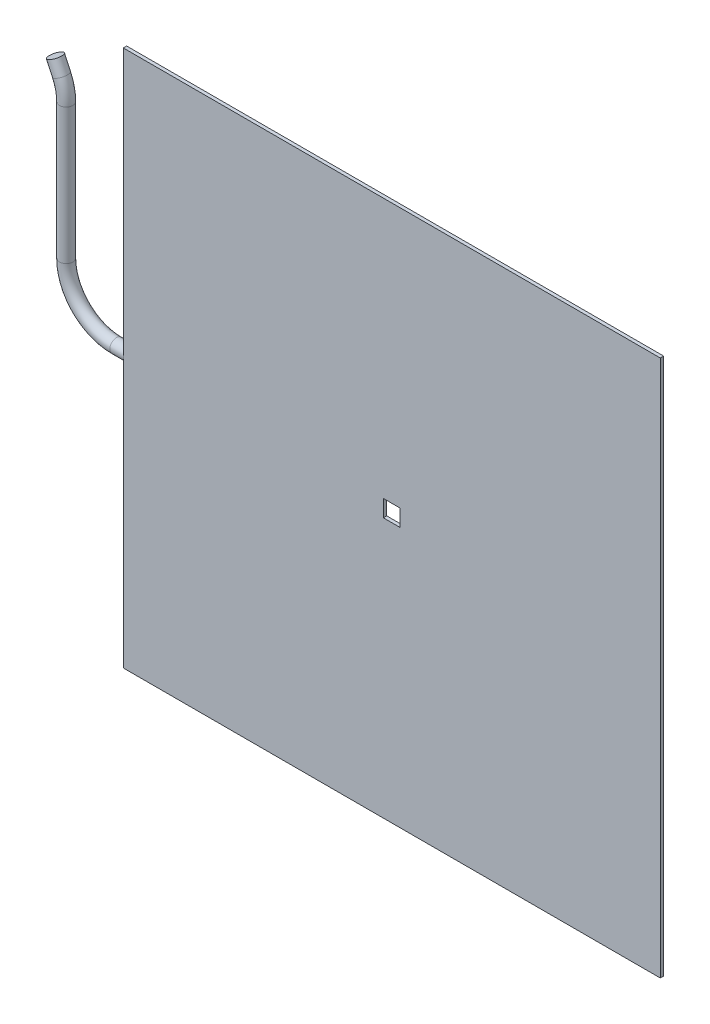
ISO-10303-21;
HEADER;
FILE_DESCRIPTION(('STEP AP214'),'2;1');
FILE_NAME('part.step','',(''),(''),'','','');
FILE_SCHEMA(('AUTOMOTIVE_DESIGN { 1 0 10303 214 1 1 1 1 }'));
ENDSEC;
DATA;
#1=APPLICATION_CONTEXT('core data for automotive mechanical design processes');
#2=APPLICATION_PROTOCOL_DEFINITION('international standard','automotive_design',2000,#1);
#3=PRODUCT_CONTEXT('',#1,'mechanical');
#4=PRODUCT('Part','Part','',(#3));
#5=PRODUCT_RELATED_PRODUCT_CATEGORY('part','',(#4));
#6=PRODUCT_DEFINITION_FORMATION('','',#4);
#7=PRODUCT_DEFINITION_CONTEXT('part definition',#1,'design');
#8=PRODUCT_DEFINITION('design','',#6,#7);
#9=PRODUCT_DEFINITION_SHAPE('','',#8);
#10=(LENGTH_UNIT() NAMED_UNIT(*) SI_UNIT(.MILLI.,.METRE.));
#11=(NAMED_UNIT(*) PLANE_ANGLE_UNIT() SI_UNIT($,.RADIAN.));
#12=(NAMED_UNIT(*) SI_UNIT($,.STERADIAN.) SOLID_ANGLE_UNIT());
#13=UNCERTAINTY_MEASURE_WITH_UNIT(LENGTH_MEASURE(1.E-05),#10,'distance_accuracy_value','');
#14=(GEOMETRIC_REPRESENTATION_CONTEXT(3) GLOBAL_UNCERTAINTY_ASSIGNED_CONTEXT((#13)) GLOBAL_UNIT_ASSIGNED_CONTEXT((#10,
#11,#12)) REPRESENTATION_CONTEXT('',''));
#15=CARTESIAN_POINT('',(0.,0.,0.));
#16=DIRECTION('',(0.,0.,1.));
#17=DIRECTION('',(1.,0.,0.));
#18=AXIS2_PLACEMENT_3D('',#15,#16,#17);
#19=CARTESIAN_POINT('',(-160.,-160.,1.5));
#20=DIRECTION('',(-0.707106781186547,0.,-0.707106781186547));
#21=DIRECTION('',(0.,1.,0.));
#22=AXIS2_PLACEMENT_3D('',#19,#20,#21);
#23=PLANE('',#22);
#24=DIRECTION('',(-0.707106781186548,0.,0.707106781186548));
#25=VECTOR('',#24,1.);
#26=CARTESIAN_POINT('',(-160.,-25.,1.50000000000002));
#27=LINE('',#26,#25);
#28=CARTESIAN_POINT('',(-158.5,-25.,0.));
#29=VERTEX_POINT('',#28);
#30=CARTESIAN_POINT('',(-160.,-25.,1.5));
#31=VERTEX_POINT('',#30);
#32=EDGE_CURVE('E323',#29,#31,#27,.T.);
#33=ORIENTED_EDGE('',*,*,#32,.F.);
#34=DIRECTION('',(0.,1.,0.));
#35=VECTOR('',#34,1.);
#36=CARTESIAN_POINT('',(-158.5,160.,0.));
#37=LINE('',#36,#35);
#38=CARTESIAN_POINT('',(-158.5,-158.5,0.));
#39=VERTEX_POINT('',#38);
#40=EDGE_CURVE('E280',#39,#29,#37,.T.);
#41=ORIENTED_EDGE('',*,*,#40,.F.);
#42=DIRECTION('',(0.577350269189626,0.577350269189626,-0.577350269189626));
#43=VECTOR('',#42,1.);
#44=CARTESIAN_POINT('',(-160.,-160.,1.5));
#45=LINE('',#44,#43);
#46=CARTESIAN_POINT('',(-160.,-160.,1.5));
#47=VERTEX_POINT('',#46);
#48=EDGE_CURVE('E309',#39,#47,#45,.F.);
#49=ORIENTED_EDGE('',*,*,#48,.T.);
#50=DIRECTION('',(0.,-1.,0.));
#51=VECTOR('',#50,1.);
#52=CARTESIAN_POINT('',(-160.,-160.,1.5));
#53=LINE('',#52,#51);
#54=EDGE_CURVE('E286',#31,#47,#53,.T.);
#55=ORIENTED_EDGE('',*,*,#54,.F.);
#56=EDGE_LOOP('',(#33,#41,#49,#55));
#57=FACE_BOUND('',#56,.T.);
#58=ADVANCED_FACE('F38',(#57),#23,.T.);
#59=CARTESIAN_POINT('',(160.,-160.,3.5));
#60=DIRECTION('',(-1.,0.,0.));
#61=DIRECTION('',(0.,0.,1.));
#62=AXIS2_PLACEMENT_3D('',#59,#60,#61);
#63=PLANE('',#62);
#64=DIRECTION('',(0.,0.,-1.));
#65=VECTOR('',#64,1.);
#66=CARTESIAN_POINT('',(160.,-160.,3.5));
#67=LINE('',#66,#65);
#68=CARTESIAN_POINT('',(160.,-160.,3.5));
#69=VERTEX_POINT('',#68);
#70=CARTESIAN_POINT('',(160.,-160.,1.5));
#71=VERTEX_POINT('',#70);
#72=EDGE_CURVE('E251',#69,#71,#67,.T.);
#73=ORIENTED_EDGE('',*,*,#72,.T.);
#74=DIRECTION('',(0.,1.,0.));
#75=VECTOR('',#74,1.);
#76=CARTESIAN_POINT('',(160.,160.,1.5));
#77=LINE('',#76,#75);
#78=CARTESIAN_POINT('',(160.,160.,1.5));
#79=VERTEX_POINT('',#78);
#80=EDGE_CURVE('E292',#71,#79,#77,.T.);
#81=ORIENTED_EDGE('',*,*,#80,.T.);
#82=DIRECTION('',(0.,0.,-1.));
#83=VECTOR('',#82,1.);
#84=CARTESIAN_POINT('',(160.,160.,3.5));
#85=LINE('',#84,#83);
#86=CARTESIAN_POINT('',(160.,160.,3.5));
#87=VERTEX_POINT('',#86);
#88=EDGE_CURVE('E260',#87,#79,#85,.T.);
#89=ORIENTED_EDGE('',*,*,#88,.F.);
#90=DIRECTION('',(0.,1.,0.));
#91=VECTOR('',#90,1.);
#92=CARTESIAN_POINT('',(160.,-160.,3.5));
#93=LINE('',#92,#91);
#94=EDGE_CURVE('E234',#69,#87,#93,.T.);
#95=ORIENTED_EDGE('',*,*,#94,.F.);
#96=EDGE_LOOP('',(#73,#81,#89,#95));
#97=FACE_BOUND('',#96,.T.);
#98=ADVANCED_FACE('F437',(#97),#63,.F.);
#99=CARTESIAN_POINT('',(-160.,160.,3.5));
#100=DIRECTION('',(0.,-1.,0.));
#101=DIRECTION('',(0.,0.,-1.));
#102=AXIS2_PLACEMENT_3D('',#99,#100,#101);
#103=PLANE('',#102);
#104=ORIENTED_EDGE('',*,*,#88,.T.);
#105=DIRECTION('',(-1.,0.,0.));
#106=VECTOR('',#105,1.);
#107=CARTESIAN_POINT('',(-160.,160.,1.5));
#108=LINE('',#107,#106);
#109=CARTESIAN_POINT('',(-160.,160.,1.5));
#110=VERTEX_POINT('',#109);
#111=EDGE_CURVE('E263',#79,#110,#108,.T.);
#112=ORIENTED_EDGE('',*,*,#111,.T.);
#113=DIRECTION('',(0.,0.,-1.));
#114=VECTOR('',#113,1.);
#115=CARTESIAN_POINT('',(-160.,160.,3.5));
#116=LINE('',#115,#114);
#117=CARTESIAN_POINT('',(-160.,160.,3.5));
#118=VERTEX_POINT('',#117);
#119=EDGE_CURVE('E257',#118,#110,#116,.T.);
#120=ORIENTED_EDGE('',*,*,#119,.F.);
#121=DIRECTION('',(-1.,0.,0.));
#122=VECTOR('',#121,1.);
#123=CARTESIAN_POINT('',(-160.,160.,3.5));
#124=LINE('',#123,#122);
#125=EDGE_CURVE('E245',#87,#118,#124,.T.);
#126=ORIENTED_EDGE('',*,*,#125,.F.);
#127=EDGE_LOOP('',(#104,#112,#120,#126));
#128=FACE_BOUND('',#127,.T.);
#129=ADVANCED_FACE('F387',(#128),#103,.F.);
#130=CARTESIAN_POINT('',(-160.,-160.,3.5));
#131=DIRECTION('',(1.,0.,0.));
#132=DIRECTION('',(0.,0.,-1.));
#133=AXIS2_PLACEMENT_3D('',#130,#131,#132);
#134=PLANE('',#133);
#135=DIRECTION('',(0.,1.,0.));
#136=VECTOR('',#135,1.);
#137=CARTESIAN_POINT('',(-160.,-25.,-5.));
#138=LINE('',#137,#136);
#139=CARTESIAN_POINT('',(-160.,0.,-5.));
#140=VERTEX_POINT('',#139);
#141=CARTESIAN_POINT('',(-160.,24.,-5.));
#142=VERTEX_POINT('',#141);
#143=EDGE_CURVE('E201',#140,#142,#138,.T.);
#144=ORIENTED_EDGE('',*,*,#143,.F.);
#145=CARTESIAN_POINT('',(-160.,0.,-1.));
#146=DIRECTION('',(1.,0.,0.));
#147=DIRECTION('',(0.,0.,-1.));
#148=AXIS2_PLACEMENT_3D('',#145,#146,#147);
#149=CIRCLE('',#148,4.);
#150=EDGE_CURVE('E53',#140,#140,#149,.T.);
#151=ORIENTED_EDGE('',*,*,#150,.T.);
#152=CARTESIAN_POINT('',(-160.,-24.0000000000001,-5.));
#153=VERTEX_POINT('',#152);
#154=EDGE_CURVE('E202',#153,#140,#138,.T.);
#155=ORIENTED_EDGE('',*,*,#154,.F.);
#156=DIRECTION('',(0.,0.707106781186552,-0.707106781186543));
#157=VECTOR('',#156,1.);
#158=CARTESIAN_POINT('',(-160.,-24.,-5.00000000000002));
#159=LINE('',#158,#157);
#160=CARTESIAN_POINT('',(-160.,-25.,-4.00000000000007));
#161=VERTEX_POINT('',#160);
#162=EDGE_CURVE('E334',#153,#161,#159,.F.);
#163=ORIENTED_EDGE('',*,*,#162,.T.);
#164=DIRECTION('',(0.,0.,-1.));
#165=VECTOR('',#164,1.);
#166=CARTESIAN_POINT('',(-160.,-25.,1.5));
#167=LINE('',#166,#165);
#168=EDGE_CURVE('E205',#31,#161,#167,.T.);
#169=ORIENTED_EDGE('',*,*,#168,.F.);
#170=ORIENTED_EDGE('',*,*,#54,.T.);
#171=DIRECTION('',(0.,0.,-1.));
#172=VECTOR('',#171,1.);
#173=CARTESIAN_POINT('',(-160.,-160.,3.5));
#174=LINE('',#173,#172);
#175=CARTESIAN_POINT('',(-160.,-160.,3.5));
#176=VERTEX_POINT('',#175);
#177=EDGE_CURVE('E254',#176,#47,#174,.T.);
#178=ORIENTED_EDGE('',*,*,#177,.F.);
#179=DIRECTION('',(0.,-1.,0.));
#180=VECTOR('',#179,1.);
#181=CARTESIAN_POINT('',(-160.,-160.,3.5));
#182=LINE('',#181,#180);
#183=EDGE_CURVE('E247',#118,#176,#182,.T.);
#184=ORIENTED_EDGE('',*,*,#183,.F.);
#185=ORIENTED_EDGE('',*,*,#119,.T.);
#186=CARTESIAN_POINT('',(-160.,25.,1.5));
#187=VERTEX_POINT('',#186);
#188=EDGE_CURVE('E287',#110,#187,#53,.T.);
#189=ORIENTED_EDGE('',*,*,#188,.T.);
#190=DIRECTION('',(0.,0.,-1.));
#191=VECTOR('',#190,1.);
#192=CARTESIAN_POINT('',(-160.,25.,1.5));
#193=LINE('',#192,#191);
#194=CARTESIAN_POINT('',(-160.,25.,-4.00000000000001));
#195=VERTEX_POINT('',#194);
#196=EDGE_CURVE('E206',#187,#195,#193,.T.);
#197=ORIENTED_EDGE('',*,*,#196,.T.);
#198=DIRECTION('',(0.,0.70710678118655,0.707106781186545));
#199=VECTOR('',#198,1.);
#200=CARTESIAN_POINT('',(-160.,24.,-4.99999999999998));
#201=LINE('',#200,#199);
#202=EDGE_CURVE('E331',#195,#142,#201,.F.);
#203=ORIENTED_EDGE('',*,*,#202,.T.);
#204=EDGE_LOOP('',(#144,#151,#155,#163,#169,#170,#178,#184,#185,#189,#197,#203));
#205=FACE_BOUND('',#204,.T.);
#206=ADVANCED_FACE('F377',(#205),#134,.F.);
#207=CARTESIAN_POINT('',(-160.,-160.,3.5));
#208=DIRECTION('',(0.,1.,0.));
#209=DIRECTION('',(0.,0.,1.));
#210=AXIS2_PLACEMENT_3D('',#207,#208,#209);
#211=PLANE('',#210);
#212=ORIENTED_EDGE('',*,*,#177,.T.);
#213=DIRECTION('',(1.,0.,0.));
#214=VECTOR('',#213,1.);
#215=CARTESIAN_POINT('',(160.,-160.,1.5));
#216=LINE('',#215,#214);
#217=EDGE_CURVE('E290',#47,#71,#216,.T.);
#218=ORIENTED_EDGE('',*,*,#217,.T.);
#219=ORIENTED_EDGE('',*,*,#72,.F.);
#220=DIRECTION('',(1.,0.,0.));
#221=VECTOR('',#220,1.);
#222=CARTESIAN_POINT('',(-160.,-160.,3.5));
#223=LINE('',#222,#221);
#224=EDGE_CURVE('E249',#176,#69,#223,.T.);
#225=ORIENTED_EDGE('',*,*,#224,.F.);
#226=EDGE_LOOP('',(#212,#218,#219,#225));
#227=FACE_BOUND('',#226,.T.);
#228=ADVANCED_FACE('F428',(#227),#211,.F.);
#229=CARTESIAN_POINT('',(0.,0.,3.5));
#230=DIRECTION('',(0.,0.,-1.));
#231=DIRECTION('',(-1.,0.,0.));
#232=AXIS2_PLACEMENT_3D('',#229,#230,#231);
#233=PLANE('',#232);
#234=DIRECTION('',(-1.,0.,0.));
#235=VECTOR('',#234,1.);
#236=CARTESIAN_POINT('',(5.,-5.,3.5));
#237=LINE('',#236,#235);
#238=CARTESIAN_POINT('',(5.,-5.,3.5));
#239=VERTEX_POINT('',#238);
#240=CARTESIAN_POINT('',(-5.,-5.,3.5));
#241=VERTEX_POINT('',#240);
#242=EDGE_CURVE('E227',#239,#241,#237,.T.);
#243=ORIENTED_EDGE('',*,*,#242,.T.);
#244=DIRECTION('',(0.,1.,0.));
#245=VECTOR('',#244,1.);
#246=CARTESIAN_POINT('',(-5.,-5.,3.5));
#247=LINE('',#246,#245);
#248=CARTESIAN_POINT('',(-5.,5.,3.5));
#249=VERTEX_POINT('',#248);
#250=EDGE_CURVE('E217',#241,#249,#247,.T.);
#251=ORIENTED_EDGE('',*,*,#250,.T.);
#252=DIRECTION('',(1.,0.,0.));
#253=VECTOR('',#252,1.);
#254=CARTESIAN_POINT('',(5.,5.,3.5));
#255=LINE('',#254,#253);
#256=CARTESIAN_POINT('',(5.,5.,3.5));
#257=VERTEX_POINT('',#256);
#258=EDGE_CURVE('E220',#249,#257,#255,.T.);
#259=ORIENTED_EDGE('',*,*,#258,.T.);
#260=DIRECTION('',(0.,-1.,0.));
#261=VECTOR('',#260,1.);
#262=CARTESIAN_POINT('',(5.,-5.,3.5));
#263=LINE('',#262,#261);
#264=EDGE_CURVE('E224',#257,#239,#263,.T.);
#265=ORIENTED_EDGE('',*,*,#264,.T.);
#266=EDGE_LOOP('',(#243,#251,#259,#265));
#267=FACE_BOUND('',#266,.T.);
#268=ORIENTED_EDGE('',*,*,#94,.T.);
#269=ORIENTED_EDGE('',*,*,#125,.T.);
#270=ORIENTED_EDGE('',*,*,#183,.T.);
#271=ORIENTED_EDGE('',*,*,#224,.T.);
#272=EDGE_LOOP('',(#268,#269,#270,#271));
#273=FACE_BOUND('',#272,.T.);
#274=ADVANCED_FACE('F440',(#267,#273),#233,.F.);
#275=CARTESIAN_POINT('',(0.,0.,0.));
#276=DIRECTION('',(0.,0.,-1.));
#277=DIRECTION('',(-1.,0.,0.));
#278=AXIS2_PLACEMENT_3D('',#275,#276,#277);
#279=PLANE('',#278);
#280=DIRECTION('',(0.990675330789371,0.136243858450099,0.));
#281=VECTOR('',#280,1.);
#282=CARTESIAN_POINT('',(-119.90443403571,-24.6948925578154,0.));
#283=LINE('',#282,#281);
#284=CARTESIAN_POINT('',(-122.122973789729,-25.,0.));
#285=VERTEX_POINT('',#284);
#286=CARTESIAN_POINT('',(-120.285172410191,-24.7472540768592,0.));
#287=VERTEX_POINT('',#286);
#288=EDGE_CURVE('E350',#285,#287,#283,.T.);
#289=ORIENTED_EDGE('',*,*,#288,.T.);
#290=DIRECTION('',(0.,1.,0.));
#291=VECTOR('',#290,1.);
#292=CARTESIAN_POINT('',(-120.285172410191,160.001,0.));
#293=LINE('',#292,#291);
#294=CARTESIAN_POINT('',(-120.285172410191,24.7472540768591,0.));
#295=VERTEX_POINT('',#294);
#296=EDGE_CURVE('E12',#287,#295,#293,.T.);
#297=ORIENTED_EDGE('',*,*,#296,.T.);
#298=DIRECTION('',(-0.990675330789371,0.136243858450098,0.));
#299=VECTOR('',#298,1.);
#300=CARTESIAN_POINT('',(-119.878278537556,24.6912954903631,0.));
#301=LINE('',#300,#299);
#302=CARTESIAN_POINT('',(-122.12297378973,25.,0.));
#303=VERTEX_POINT('',#302);
#304=EDGE_CURVE('E47',#295,#303,#301,.T.);
#305=ORIENTED_EDGE('',*,*,#304,.T.);
#306=DIRECTION('',(1.,0.,0.));
#307=VECTOR('',#306,1.);
#308=CARTESIAN_POINT('',(0.,25.,0.));
#309=LINE('',#308,#307);
#310=CARTESIAN_POINT('',(-158.5,25.,0.));
#311=VERTEX_POINT('',#310);
#312=EDGE_CURVE('E209',#311,#303,#309,.T.);
#313=ORIENTED_EDGE('',*,*,#312,.F.);
#314=CARTESIAN_POINT('',(-158.5,158.5,0.));
#315=VERTEX_POINT('',#314);
#316=EDGE_CURVE('E279',#311,#315,#37,.T.);
#317=ORIENTED_EDGE('',*,*,#316,.T.);
#318=DIRECTION('',(1.,0.,0.));
#319=VECTOR('',#318,1.);
#320=CARTESIAN_POINT('',(160.,158.5,0.));
#321=LINE('',#320,#319);
#322=CARTESIAN_POINT('',(158.5,158.5,0.));
#323=VERTEX_POINT('',#322);
#324=EDGE_CURVE('E283',#315,#323,#321,.T.);
#325=ORIENTED_EDGE('',*,*,#324,.T.);
#326=DIRECTION('',(0.,-1.,0.));
#327=VECTOR('',#326,1.);
#328=CARTESIAN_POINT('',(158.5,-160.,0.));
#329=LINE('',#328,#327);
#330=CARTESIAN_POINT('',(158.5,-158.5,0.));
#331=VERTEX_POINT('',#330);
#332=EDGE_CURVE('E275',#323,#331,#329,.T.);
#333=ORIENTED_EDGE('',*,*,#332,.T.);
#334=DIRECTION('',(-1.,0.,0.));
#335=VECTOR('',#334,1.);
#336=CARTESIAN_POINT('',(-160.,-158.5,0.));
#337=LINE('',#336,#335);
#338=EDGE_CURVE('E277',#331,#39,#337,.T.);
#339=ORIENTED_EDGE('',*,*,#338,.T.);
#340=ORIENTED_EDGE('',*,*,#40,.T.);
#341=DIRECTION('',(-1.,0.,0.));
#342=VECTOR('',#341,1.);
#343=CARTESIAN_POINT('',(0.,-25.,0.));
#344=LINE('',#343,#342);
#345=EDGE_CURVE('E214',#285,#29,#344,.T.);
#346=ORIENTED_EDGE('',*,*,#345,.F.);
#347=EDGE_LOOP('',(#289,#297,#305,#313,#317,#325,#333,#339,#340,#346));
#348=FACE_BOUND('',#347,.T.);
#349=DIRECTION('',(0.,1.,0.));
#350=VECTOR('',#349,1.);
#351=CARTESIAN_POINT('',(6.5,5.,0.));
#352=LINE('',#351,#350);
#353=CARTESIAN_POINT('',(6.5,-6.5,0.));
#354=VERTEX_POINT('',#353);
#355=CARTESIAN_POINT('',(6.5,6.5,0.));
#356=VERTEX_POINT('',#355);
#357=EDGE_CURVE('E270',#354,#356,#352,.T.);
#358=ORIENTED_EDGE('',*,*,#357,.T.);
#359=DIRECTION('',(-1.,0.,0.));
#360=VECTOR('',#359,1.);
#361=CARTESIAN_POINT('',(-5.,6.5,0.));
#362=LINE('',#361,#360);
#363=CARTESIAN_POINT('',(-6.5,6.5,0.));
#364=VERTEX_POINT('',#363);
#365=EDGE_CURVE('E272',#356,#364,#362,.T.);
#366=ORIENTED_EDGE('',*,*,#365,.T.);
#367=DIRECTION('',(0.,-1.,0.));
#368=VECTOR('',#367,1.);
#369=CARTESIAN_POINT('',(-6.5,-5.,0.));
#370=LINE('',#369,#368);
#371=CARTESIAN_POINT('',(-6.5,-6.5,0.));
#372=VERTEX_POINT('',#371);
#373=EDGE_CURVE('E266',#364,#372,#370,.T.);
#374=ORIENTED_EDGE('',*,*,#373,.T.);
#375=DIRECTION('',(1.,0.,0.));
#376=VECTOR('',#375,1.);
#377=CARTESIAN_POINT('',(5.,-6.5,0.));
#378=LINE('',#377,#376);
#379=EDGE_CURVE('E268',#372,#354,#378,.T.);
#380=ORIENTED_EDGE('',*,*,#379,.T.);
#381=EDGE_LOOP('',(#358,#366,#374,#380));
#382=FACE_BOUND('',#381,.T.);
#383=ADVANCED_FACE('F394',(#348,#382),#279,.T.);
#384=CARTESIAN_POINT('',(-5.,-5.,3.5));
#385=DIRECTION('',(-1.,0.,0.));
#386=DIRECTION('',(0.,0.,1.));
#387=AXIS2_PLACEMENT_3D('',#384,#385,#386);
#388=PLANE('',#387);
#389=DIRECTION('',(0.,0.,-1.));
#390=VECTOR('',#389,1.);
#391=CARTESIAN_POINT('',(-5.,-5.,3.5));
#392=LINE('',#391,#390);
#393=CARTESIAN_POINT('',(-5.,-5.,1.5));
#394=VERTEX_POINT('',#393);
#395=EDGE_CURVE('E231',#241,#394,#392,.T.);
#396=ORIENTED_EDGE('',*,*,#395,.T.);
#397=DIRECTION('',(0.,1.,0.));
#398=VECTOR('',#397,1.);
#399=CARTESIAN_POINT('',(-5.,5.,1.5));
#400=LINE('',#399,#398);
#401=CARTESIAN_POINT('',(-5.,5.,1.5));
#402=VERTEX_POINT('',#401);
#403=EDGE_CURVE('E301',#394,#402,#400,.T.);
#404=ORIENTED_EDGE('',*,*,#403,.T.);
#405=DIRECTION('',(0.,0.,-1.));
#406=VECTOR('',#405,1.);
#407=CARTESIAN_POINT('',(-5.,5.,3.5));
#408=LINE('',#407,#406);
#409=EDGE_CURVE('E230',#249,#402,#408,.T.);
#410=ORIENTED_EDGE('',*,*,#409,.F.);
#411=ORIENTED_EDGE('',*,*,#250,.F.);
#412=EDGE_LOOP('',(#396,#404,#410,#411));
#413=FACE_BOUND('',#412,.T.);
#414=ADVANCED_FACE('F448',(#413),#388,.F.);
#415=CARTESIAN_POINT('',(5.,-5.,3.5));
#416=DIRECTION('',(0.,-1.,0.));
#417=DIRECTION('',(0.,0.,-1.));
#418=AXIS2_PLACEMENT_3D('',#415,#416,#417);
#419=PLANE('',#418);
#420=DIRECTION('',(0.,0.,-1.));
#421=VECTOR('',#420,1.);
#422=CARTESIAN_POINT('',(5.,-5.,3.5));
#423=LINE('',#422,#421);
#424=CARTESIAN_POINT('',(5.,-5.,1.5));
#425=VERTEX_POINT('',#424);
#426=EDGE_CURVE('E235',#239,#425,#423,.T.);
#427=ORIENTED_EDGE('',*,*,#426,.T.);
#428=DIRECTION('',(-1.,0.,0.));
#429=VECTOR('',#428,1.);
#430=CARTESIAN_POINT('',(-5.,-5.,1.5));
#431=LINE('',#430,#429);
#432=EDGE_CURVE('E299',#425,#394,#431,.T.);
#433=ORIENTED_EDGE('',*,*,#432,.T.);
#434=ORIENTED_EDGE('',*,*,#395,.F.);
#435=ORIENTED_EDGE('',*,*,#242,.F.);
#436=EDGE_LOOP('',(#427,#433,#434,#435));
#437=FACE_BOUND('',#436,.T.);
#438=ADVANCED_FACE('F512',(#437),#419,.F.);
#439=CARTESIAN_POINT('',(5.,-5.,3.5));
#440=DIRECTION('',(1.,0.,0.));
#441=DIRECTION('',(0.,0.,-1.));
#442=AXIS2_PLACEMENT_3D('',#439,#440,#441);
#443=PLANE('',#442);
#444=DIRECTION('',(0.,0.,-1.));
#445=VECTOR('',#444,1.);
#446=CARTESIAN_POINT('',(5.,5.,3.5));
#447=LINE('',#446,#445);
#448=CARTESIAN_POINT('',(5.,5.,1.5));
#449=VERTEX_POINT('',#448);
#450=EDGE_CURVE('E238',#257,#449,#447,.T.);
#451=ORIENTED_EDGE('',*,*,#450,.T.);
#452=DIRECTION('',(0.,-1.,0.));
#453=VECTOR('',#452,1.);
#454=CARTESIAN_POINT('',(5.,-5.,1.5));
#455=LINE('',#454,#453);
#456=EDGE_CURVE('E297',#449,#425,#455,.T.);
#457=ORIENTED_EDGE('',*,*,#456,.T.);
#458=ORIENTED_EDGE('',*,*,#426,.F.);
#459=ORIENTED_EDGE('',*,*,#264,.F.);
#460=EDGE_LOOP('',(#451,#457,#458,#459));
#461=FACE_BOUND('',#460,.T.);
#462=ADVANCED_FACE('F515',(#461),#443,.F.);
#463=CARTESIAN_POINT('',(5.,5.,3.5));
#464=DIRECTION('',(0.,1.,0.));
#465=DIRECTION('',(0.,0.,1.));
#466=AXIS2_PLACEMENT_3D('',#463,#464,#465);
#467=PLANE('',#466);
#468=ORIENTED_EDGE('',*,*,#409,.T.);
#469=DIRECTION('',(1.,0.,0.));
#470=VECTOR('',#469,1.);
#471=CARTESIAN_POINT('',(5.,5.,1.5));
#472=LINE('',#471,#470);
#473=EDGE_CURVE('E294',#402,#449,#472,.T.);
#474=ORIENTED_EDGE('',*,*,#473,.T.);
#475=ORIENTED_EDGE('',*,*,#450,.F.);
#476=ORIENTED_EDGE('',*,*,#258,.F.);
#477=EDGE_LOOP('',(#468,#474,#475,#476));
#478=FACE_BOUND('',#477,.T.);
#479=ADVANCED_FACE('F469',(#478),#467,.F.);
#480=CARTESIAN_POINT('',(-160.,-160.,1.5));
#481=DIRECTION('',(0.,-0.707106781186547,-0.707106781186547));
#482=DIRECTION('',(-1.,0.,0.));
#483=AXIS2_PLACEMENT_3D('',#480,#481,#482);
#484=PLANE('',#483);
#485=ORIENTED_EDGE('',*,*,#48,.F.);
#486=ORIENTED_EDGE('',*,*,#338,.F.);
#487=DIRECTION('',(-0.577350269189626,0.577350269189626,-0.577350269189626));
#488=VECTOR('',#487,1.);
#489=CARTESIAN_POINT('',(160.,-160.,1.5));
#490=LINE('',#489,#488);
#491=EDGE_CURVE('E221',#71,#331,#490,.T.);
#492=ORIENTED_EDGE('',*,*,#491,.F.);
#493=ORIENTED_EDGE('',*,*,#217,.F.);
#494=EDGE_LOOP('',(#485,#486,#492,#493));
#495=FACE_BOUND('',#494,.T.);
#496=ADVANCED_FACE('F432',(#495),#484,.T.);
#497=CARTESIAN_POINT('',(160.,-160.,1.5));
#498=DIRECTION('',(0.707106781186547,0.,-0.707106781186547));
#499=DIRECTION('',(0.,-1.,0.));
#500=AXIS2_PLACEMENT_3D('',#497,#498,#499);
#501=PLANE('',#500);
#502=ORIENTED_EDGE('',*,*,#491,.T.);
#503=ORIENTED_EDGE('',*,*,#332,.F.);
#504=DIRECTION('',(0.577350269189626,0.577350269189626,0.577350269189626));
#505=VECTOR('',#504,1.);
#506=CARTESIAN_POINT('',(53.3333333333333,53.3333333333333,-105.166666666667));
#507=LINE('',#506,#505);
#508=EDGE_CURVE('E306',#79,#323,#507,.F.);
#509=ORIENTED_EDGE('',*,*,#508,.F.);
#510=ORIENTED_EDGE('',*,*,#80,.F.);
#511=EDGE_LOOP('',(#502,#503,#509,#510));
#512=FACE_BOUND('',#511,.T.);
#513=ADVANCED_FACE('F435',(#512),#501,.T.);
#514=DIRECTION('',(0.707106781186548,0.,-0.707106781186548));
#515=VECTOR('',#514,1.);
#516=CARTESIAN_POINT('',(-160.,25.,1.50000000000003));
#517=LINE('',#516,#515);
#518=EDGE_CURVE('E303',#187,#311,#517,.T.);
#519=ORIENTED_EDGE('',*,*,#518,.F.);
#520=ORIENTED_EDGE('',*,*,#188,.F.);
#521=DIRECTION('',(0.577350269189626,-0.577350269189626,-0.577350269189626));
#522=VECTOR('',#521,1.);
#523=CARTESIAN_POINT('',(-53.3333333333333,53.3333333333333,-105.166666666667));
#524=LINE('',#523,#522);
#525=EDGE_CURVE('E304',#315,#110,#524,.F.);
#526=ORIENTED_EDGE('',*,*,#525,.F.);
#527=ORIENTED_EDGE('',*,*,#316,.F.);
#528=EDGE_LOOP('',(#519,#520,#526,#527));
#529=FACE_BOUND('',#528,.T.);
#530=ADVANCED_FACE('F383',(#529),#23,.T.);
#531=CARTESIAN_POINT('',(-160.,160.,1.5));
#532=DIRECTION('',(0.,0.707106781186547,-0.707106781186547));
#533=DIRECTION('',(1.,0.,0.));
#534=AXIS2_PLACEMENT_3D('',#531,#532,#533);
#535=PLANE('',#534);
#536=ORIENTED_EDGE('',*,*,#508,.T.);
#537=ORIENTED_EDGE('',*,*,#324,.F.);
#538=ORIENTED_EDGE('',*,*,#525,.T.);
#539=ORIENTED_EDGE('',*,*,#111,.F.);
#540=EDGE_LOOP('',(#536,#537,#538,#539));
#541=FACE_BOUND('',#540,.T.);
#542=ADVANCED_FACE('F391',(#541),#535,.T.);
#543=CARTESIAN_POINT('',(5.,-5.,1.5));
#544=DIRECTION('',(0.,0.707106781186547,-0.707106781186547));
#545=DIRECTION('',(1.,0.,0.));
#546=AXIS2_PLACEMENT_3D('',#543,#544,#545);
#547=PLANE('',#546);
#548=DIRECTION('',(0.577350269189626,-0.577350269189626,-0.577350269189626));
#549=VECTOR('',#548,1.);
#550=CARTESIAN_POINT('',(5.,-5.,1.5));
#551=LINE('',#550,#549);
#552=EDGE_CURVE('E317',#354,#425,#551,.F.);
#553=ORIENTED_EDGE('',*,*,#552,.F.);
#554=ORIENTED_EDGE('',*,*,#379,.F.);
#555=DIRECTION('',(-0.577350269189626,-0.577350269189626,-0.577350269189626));
#556=VECTOR('',#555,1.);
#557=CARTESIAN_POINT('',(-1.66666666666667,-1.66666666666667,4.83333333333333));
#558=LINE('',#557,#556);
#559=EDGE_CURVE('E307',#394,#372,#558,.T.);
#560=ORIENTED_EDGE('',*,*,#559,.F.);
#561=ORIENTED_EDGE('',*,*,#432,.F.);
#562=EDGE_LOOP('',(#553,#554,#560,#561));
#563=FACE_BOUND('',#562,.T.);
#564=ADVANCED_FACE('F465',(#563),#547,.T.);
#565=CARTESIAN_POINT('',(-5.,-5.,1.5));
#566=DIRECTION('',(0.707106781186547,0.,-0.707106781186547));
#567=DIRECTION('',(0.,-1.,0.));
#568=AXIS2_PLACEMENT_3D('',#565,#566,#567);
#569=PLANE('',#568);
#570=ORIENTED_EDGE('',*,*,#559,.T.);
#571=ORIENTED_EDGE('',*,*,#373,.F.);
#572=DIRECTION('',(0.577350269189626,-0.577350269189626,0.577350269189626));
#573=VECTOR('',#572,1.);
#574=CARTESIAN_POINT('',(-1.66666666666667,1.66666666666667,4.83333333333333));
#575=LINE('',#574,#573);
#576=EDGE_CURVE('E315',#402,#364,#575,.F.);
#577=ORIENTED_EDGE('',*,*,#576,.F.);
#578=ORIENTED_EDGE('',*,*,#403,.F.);
#579=EDGE_LOOP('',(#570,#571,#577,#578));
#580=FACE_BOUND('',#579,.T.);
#581=ADVANCED_FACE('F479',(#580),#569,.T.);
#582=CARTESIAN_POINT('',(5.,-5.,1.5));
#583=DIRECTION('',(-0.707106781186547,0.,-0.707106781186547));
#584=DIRECTION('',(0.,1.,0.));
#585=AXIS2_PLACEMENT_3D('',#582,#583,#584);
#586=PLANE('',#585);
#587=ORIENTED_EDGE('',*,*,#552,.T.);
#588=ORIENTED_EDGE('',*,*,#456,.F.);
#589=DIRECTION('',(0.577350269189626,0.577350269189626,-0.577350269189626));
#590=VECTOR('',#589,1.);
#591=CARTESIAN_POINT('',(5.,5.,1.5));
#592=LINE('',#591,#590);
#593=EDGE_CURVE('E216',#356,#449,#592,.F.);
#594=ORIENTED_EDGE('',*,*,#593,.F.);
#595=ORIENTED_EDGE('',*,*,#357,.F.);
#596=EDGE_LOOP('',(#587,#588,#594,#595));
#597=FACE_BOUND('',#596,.T.);
#598=ADVANCED_FACE('F475',(#597),#586,.T.);
#599=CARTESIAN_POINT('',(5.,5.,1.5));
#600=DIRECTION('',(0.,-0.707106781186547,-0.707106781186547));
#601=DIRECTION('',(-1.,0.,0.));
#602=AXIS2_PLACEMENT_3D('',#599,#600,#601);
#603=PLANE('',#602);
#604=ORIENTED_EDGE('',*,*,#576,.T.);
#605=ORIENTED_EDGE('',*,*,#365,.F.);
#606=ORIENTED_EDGE('',*,*,#593,.T.);
#607=ORIENTED_EDGE('',*,*,#473,.F.);
#608=EDGE_LOOP('',(#604,#605,#606,#607));
#609=FACE_BOUND('',#608,.T.);
#610=ADVANCED_FACE('F472',(#609),#603,.T.);
#611=CARTESIAN_POINT('',(-120.,-25.,1.5));
#612=DIRECTION('',(0.,-1.,0.));
#613=DIRECTION('',(1.,0.,0.));
#614=AXIS2_PLACEMENT_3D('',#611,#612,#613);
#615=PLANE('',#614);
#616=ORIENTED_EDGE('',*,*,#168,.T.);
#617=DIRECTION('',(1.,0.,0.));
#618=VECTOR('',#617,1.);
#619=CARTESIAN_POINT('',(-120.,-25.,-4.00000000000007));
#620=LINE('',#619,#618);
#621=CARTESIAN_POINT('',(-150.931965752235,-25.,-4.00000000000007));
#622=VERTEX_POINT('',#621);
#623=EDGE_CURVE('E338',#161,#622,#620,.T.);
#624=ORIENTED_EDGE('',*,*,#623,.T.);
#625=DIRECTION('',(0.990498123109152,0.,0.137526245194315));
#626=VECTOR('',#625,1.);
#627=CARTESIAN_POINT('',(-120.137526245194,-25.,0.275670533300002));
#628=LINE('',#627,#626);
#629=EDGE_CURVE('E336',#622,#285,#628,.T.);
#630=ORIENTED_EDGE('',*,*,#629,.T.);
#631=ORIENTED_EDGE('',*,*,#345,.T.);
#632=ORIENTED_EDGE('',*,*,#32,.T.);
#633=EDGE_LOOP('',(#616,#624,#630,#631,#632));
#634=FACE_BOUND('',#633,.T.);
#635=ADVANCED_FACE('F417',(#634),#615,.T.);
#636=CARTESIAN_POINT('',(-120.,25.,1.5));
#637=DIRECTION('',(0.,1.,0.));
#638=DIRECTION('',(-1.,0.,0.));
#639=AXIS2_PLACEMENT_3D('',#636,#637,#638);
#640=PLANE('',#639);
#641=DIRECTION('',(-0.990498123109152,0.,-0.137526245194315));
#642=VECTOR('',#641,1.);
#643=CARTESIAN_POINT('',(-151.00040062598,25.,-4.00950187689086));
#644=LINE('',#643,#642);
#645=CARTESIAN_POINT('',(-150.931965752235,25.,-4.00000000000001));
#646=VERTEX_POINT('',#645);
#647=EDGE_CURVE('E346',#303,#646,#644,.T.);
#648=ORIENTED_EDGE('',*,*,#647,.T.);
#649=DIRECTION('',(-1.,0.,0.));
#650=VECTOR('',#649,1.);
#651=CARTESIAN_POINT('',(-120.,25.,-4.00000000000001));
#652=LINE('',#651,#650);
#653=EDGE_CURVE('E348',#646,#195,#652,.T.);
#654=ORIENTED_EDGE('',*,*,#653,.T.);
#655=ORIENTED_EDGE('',*,*,#196,.F.);
#656=ORIENTED_EDGE('',*,*,#518,.T.);
#657=ORIENTED_EDGE('',*,*,#312,.T.);
#658=EDGE_LOOP('',(#648,#654,#655,#656,#657));
#659=FACE_BOUND('',#658,.T.);
#660=ADVANCED_FACE('F373',(#659),#640,.T.);
#661=CARTESIAN_POINT('',(0.,0.,-5.));
#662=DIRECTION('',(0.,0.,-1.));
#663=DIRECTION('',(-1.,0.,0.));
#664=AXIS2_PLACEMENT_3D('',#661,#662,#663);
#665=PLANE('',#664);
#666=DIRECTION('',(0.,-1.,0.));
#667=VECTOR('',#666,1.);
#668=CARTESIAN_POINT('',(-150.862874380785,160.001,-5.));
#669=LINE('',#668,#667);
#670=CARTESIAN_POINT('',(-150.862874380785,24.,-5.));
#671=VERTEX_POINT('',#670);
#672=CARTESIAN_POINT('',(-150.862874380785,-24.,-5.));
#673=VERTEX_POINT('',#672);
#674=EDGE_CURVE('E198',#671,#673,#669,.T.);
#675=ORIENTED_EDGE('',*,*,#674,.T.);
#676=DIRECTION('',(-1.,0.,0.));
#677=VECTOR('',#676,1.);
#678=CARTESIAN_POINT('',(0.,-24.,-5.));
#679=LINE('',#678,#677);
#680=EDGE_CURVE('E328',#673,#153,#679,.T.);
#681=ORIENTED_EDGE('',*,*,#680,.T.);
#682=ORIENTED_EDGE('',*,*,#154,.T.);
#683=ORIENTED_EDGE('',*,*,#143,.T.);
#684=DIRECTION('',(1.,0.,0.));
#685=VECTOR('',#684,1.);
#686=CARTESIAN_POINT('',(0.,24.,-5.));
#687=LINE('',#686,#685);
#688=EDGE_CURVE('E326',#142,#671,#687,.T.);
#689=ORIENTED_EDGE('',*,*,#688,.T.);
#690=EDGE_LOOP('',(#675,#681,#682,#683,#689));
#691=FACE_BOUND('',#690,.T.);
#692=ADVANCED_FACE('F406',(#691),#665,.T.);
#693=CARTESIAN_POINT('',(-120.,160.001,-0.714827589809084));
#694=DIRECTION('',(-0.137526245194315,0.,0.990498123109152));
#695=DIRECTION('',(0.990498123109152,0.,0.137526245194315));
#696=AXIS2_PLACEMENT_3D('',#693,#694,#695);
#697=PLANE('',#696);
#698=DIRECTION('',(0.,-1.,0.));
#699=VECTOR('',#698,1.);
#700=CARTESIAN_POINT('',(-121.161231863271,-25.,-0.876059453080489));
#701=LINE('',#700,#699);
#702=CARTESIAN_POINT('',(-121.161231863271,24.,-0.876059453080487));
#703=VERTEX_POINT('',#702);
#704=CARTESIAN_POINT('',(-121.161231863271,-24.,-0.876059453080489));
#705=VERTEX_POINT('',#704);
#706=EDGE_CURVE('E340',#703,#705,#701,.T.);
#707=ORIENTED_EDGE('',*,*,#706,.T.);
#708=DIRECTION('',(-0.990498123109152,0.,-0.137526245194315));
#709=VECTOR('',#708,1.);
#710=CARTESIAN_POINT('',(-150.862874380785,-24.0000000000001,-5.));
#711=LINE('',#710,#709);
#712=EDGE_CURVE('E344',#705,#673,#711,.T.);
#713=ORIENTED_EDGE('',*,*,#712,.T.);
#714=ORIENTED_EDGE('',*,*,#674,.F.);
#715=DIRECTION('',(0.990498123109152,0.,0.137526245194315));
#716=VECTOR('',#715,1.);
#717=CARTESIAN_POINT('',(-120.,24.,-0.714827589809083));
#718=LINE('',#717,#716);
#719=EDGE_CURVE('E342',#671,#703,#718,.T.);
#720=ORIENTED_EDGE('',*,*,#719,.T.);
#721=EDGE_LOOP('',(#707,#713,#714,#720));
#722=FACE_BOUND('',#721,.T.);
#723=ADVANCED_FACE('F402',(#722),#697,.F.);
#724=CARTESIAN_POINT('',(0.,24.,-5.));
#725=DIRECTION('',(0.,-0.707106781186545,0.70710678118655));
#726=DIRECTION('',(1.,0.,0.));
#727=AXIS2_PLACEMENT_3D('',#724,#725,#726);
#728=PLANE('',#727);
#729=ORIENTED_EDGE('',*,*,#202,.F.);
#730=ORIENTED_EDGE('',*,*,#653,.F.);
#731=DIRECTION('',(0.0487967776916379,-0.706264424449838,-0.706264424449832));
#732=VECTOR('',#731,1.);
#733=CARTESIAN_POINT('',(-151.006719874219,26.0819603145028,-2.91803968549721));
#734=LINE('',#733,#732);
#735=EDGE_CURVE('E42',#671,#646,#734,.F.);
#736=ORIENTED_EDGE('',*,*,#735,.F.);
#737=ORIENTED_EDGE('',*,*,#688,.F.);
#738=EDGE_LOOP('',(#729,#730,#736,#737));
#739=FACE_BOUND('',#738,.T.);
#740=ADVANCED_FACE('F40',(#739),#728,.F.);
#741=CARTESIAN_POINT('',(-119.835823565471,25.,0.317560604305115));
#742=DIRECTION('',(0.0972457405680239,0.707106781186547,-0.70038793960303));
#743=DIRECTION('',(0.990498123109152,0.,0.137526245194315));
#744=AXIS2_PLACEMENT_3D('',#741,#742,#743);
#745=PLANE('',#744);
#746=ORIENTED_EDGE('',*,*,#647,.F.);
#747=ORIENTED_EDGE('',*,*,#304,.F.);
#748=DIRECTION('',(0.605498068371102,0.516472824452299,0.605498068371096));
#749=VECTOR('',#748,1.);
#750=CARTESIAN_POINT('',(-78.6305506701771,60.2774750062705,41.6546217400133));
#751=LINE('',#750,#749);
#752=EDGE_CURVE('E357',#703,#295,#751,.T.);
#753=ORIENTED_EDGE('',*,*,#752,.F.);
#754=ORIENTED_EDGE('',*,*,#719,.F.);
#755=ORIENTED_EDGE('',*,*,#735,.T.);
#756=EDGE_LOOP('',(#746,#747,#753,#754,#755));
#757=FACE_BOUND('',#756,.T.);
#758=ADVANCED_FACE('F367',(#757),#745,.T.);
#759=CARTESIAN_POINT('',(-121.161231863271,160.001,-0.876059453080482));
#760=DIRECTION('',(0.707106781186544,0.,-0.707106781186552));
#761=DIRECTION('',(0.,1.,0.));
#762=AXIS2_PLACEMENT_3D('',#759,#760,#761);
#763=PLANE('',#762);
#764=ORIENTED_EDGE('',*,*,#752,.T.);
#765=ORIENTED_EDGE('',*,*,#296,.F.);
#766=DIRECTION('',(-0.605498068371102,0.516472824452301,-0.605498068371095));
#767=VECTOR('',#766,1.);
#768=CARTESIAN_POINT('',(-178.702631339824,25.081195569362,-58.4174589296319));
#769=LINE('',#768,#767);
#770=EDGE_CURVE('E355',#705,#287,#769,.F.);
#771=ORIENTED_EDGE('',*,*,#770,.F.);
#772=ORIENTED_EDGE('',*,*,#706,.F.);
#773=EDGE_LOOP('',(#764,#765,#771,#772));
#774=FACE_BOUND('',#773,.T.);
#775=ADVANCED_FACE('F399',(#774),#763,.T.);
#776=CARTESIAN_POINT('',(-120.,-24.,-0.714827589809084));
#777=DIRECTION('',(0.0972457405680245,-0.707106781186546,-0.700387939603031));
#778=DIRECTION('',(0.990498123109152,0.,0.137526245194315));
#779=AXIS2_PLACEMENT_3D('',#776,#777,#778);
#780=PLANE('',#779);
#781=ORIENTED_EDGE('',*,*,#288,.F.);
#782=ORIENTED_EDGE('',*,*,#629,.F.);
#783=DIRECTION('',(-0.0487967776916417,-0.706264424449839,0.70626442444983));
#784=VECTOR('',#783,1.);
#785=CARTESIAN_POINT('',(-150.937067734493,-25.0738439858854,-3.92615601411468));
#786=LINE('',#785,#784);
#787=EDGE_CURVE('E191',#673,#622,#786,.T.);
#788=ORIENTED_EDGE('',*,*,#787,.F.);
#789=ORIENTED_EDGE('',*,*,#712,.F.);
#790=ORIENTED_EDGE('',*,*,#770,.T.);
#791=EDGE_LOOP('',(#781,#782,#788,#789,#790));
#792=FACE_BOUND('',#791,.T.);
#793=ADVANCED_FACE('F412',(#792),#780,.T.);
#794=CARTESIAN_POINT('',(0.,-24.,-5.));
#795=DIRECTION('',(0.,0.707106781186543,0.707106781186552));
#796=DIRECTION('',(-1.,0.,0.));
#797=AXIS2_PLACEMENT_3D('',#794,#795,#796);
#798=PLANE('',#797);
#799=ORIENTED_EDGE('',*,*,#787,.T.);
#800=ORIENTED_EDGE('',*,*,#623,.F.);
#801=ORIENTED_EDGE('',*,*,#162,.F.);
#802=ORIENTED_EDGE('',*,*,#680,.F.);
#803=EDGE_LOOP('',(#799,#800,#801,#802));
#804=FACE_BOUND('',#803,.T.);
#805=ADVANCED_FACE('F415',(#804),#798,.F.);
#806=CARTESIAN_POINT('',(-165.,0.,-1.));
#807=DIRECTION('',(1.,0.,0.));
#808=DIRECTION('',(0.,0.,-1.));
#809=AXIS2_PLACEMENT_3D('',#806,#807,#808);
#810=CYLINDRICAL_SURFACE('',#809,4.);
#811=ORIENTED_EDGE('',*,*,#150,.F.);
#812=EDGE_LOOP('',(#811));
#813=FACE_BOUND('',#812,.T.);
#814=CARTESIAN_POINT('',(-168.534731141003,0.,-1.));
#815=DIRECTION('',(1.,0.,0.));
#816=DIRECTION('',(0.,0.,-1.));
#817=AXIS2_PLACEMENT_3D('',#814,#815,#816);
#818=CIRCLE('',#817,4.);
#819=CARTESIAN_POINT('',(-168.534731141003,-3.99999999999996,-1.));
#820=VERTEX_POINT('',#819);
#821=EDGE_CURVE('E730',#820,#820,#818,.T.);
#822=ORIENTED_EDGE('',*,*,#821,.T.);
#823=EDGE_LOOP('',(#822));
#824=FACE_BOUND('',#823,.T.);
#825=ADVANCED_FACE('F489',(#813,#824),#810,.T.);
#826=CARTESIAN_POINT('',(-204.938531297559,131.236493157379,-1.));
#827=DIRECTION('',(0.419635571925117,-0.907692671984896,0.));
#828=DIRECTION('',(0.,0.,-1.));
#829=AXIS2_PLACEMENT_3D('',#826,#827,#828);
#830=PLANE('',#829);
#831=CARTESIAN_POINT('',(-204.938531297559,131.236493157379,-1.));
#832=DIRECTION('',(0.419635571925117,-0.907692671984896,0.));
#833=DIRECTION('',(0.,0.,-1.));
#834=AXIS2_PLACEMENT_3D('',#831,#832,#833);
#835=CIRCLE('',#834,4.);
#836=CARTESIAN_POINT('',(-204.938531297559,131.236493157379,-5.));
#837=VERTEX_POINT('',#836);
#838=EDGE_CURVE('E185',#837,#837,#835,.T.);
#839=ORIENTED_EDGE('',*,*,#838,.F.);
#840=EDGE_LOOP('',(#839));
#841=FACE_BOUND('',#840,.T.);
#842=ADVANCED_FACE('F676',(#841),#830,.F.);
#843=CARTESIAN_POINT('',(-168.534731141003,30.,-1.));
#844=DIRECTION('',(0.,0.,-1.));
#845=DIRECTION('',(-1.,0.,0.));
#846=AXIS2_PLACEMENT_3D('',#843,#844,#845);
#847=TOROIDAL_SURFACE('',#846,30.,4.);
#848=CARTESIAN_POINT('',(-198.534731141003,30.,-1.));
#849=DIRECTION('',(0.,-1.,0.));
#850=DIRECTION('',(0.,0.,-1.));
#851=AXIS2_PLACEMENT_3D('',#848,#849,#850);
#852=CIRCLE('',#851,4.);
#853=CARTESIAN_POINT('',(-202.534731141003,30.,-1.));
#854=VERTEX_POINT('',#853);
#855=EDGE_CURVE('E728',#854,#854,#852,.T.);
#856=CARTESIAN_POINT('',(-168.534731141003,30.,-1.));
#857=DIRECTION('',(0.,0.,-1.));
#858=DIRECTION('',(-1.,0.,0.));
#859=AXIS2_PLACEMENT_3D('',#856,#857,#858);
#860=CIRCLE('',#859,34.);
#861=EDGE_CURVE('',#820,#854,#860,.T.);
#862=ORIENTED_EDGE('',*,*,#821,.F.);
#863=ORIENTED_EDGE('',*,*,#855,.T.);
#864=ORIENTED_EDGE('',*,*,#861,.T.);
#865=ORIENTED_EDGE('',*,*,#861,.F.);
#866=EDGE_LOOP('',(#862,#864,#863,#865));
#867=FACE_BOUND('',#866,.T.);
#868=ADVANCED_FACE('F684',(#867),#847,.T.);
#869=CARTESIAN_POINT('',(-198.534731141003,30.,-1.));
#870=DIRECTION('',(0.,1.,0.));
#871=DIRECTION('',(0.,0.,1.));
#872=AXIS2_PLACEMENT_3D('',#869,#870,#871);
#873=CYLINDRICAL_SURFACE('',#872,4.);
#874=CARTESIAN_POINT('',(-198.534731141003,110.785647496121,-1.));
#875=DIRECTION('',(0.,-1.,0.));
#876=DIRECTION('',(0.,0.,-1.));
#877=AXIS2_PLACEMENT_3D('',#874,#875,#876);
#878=CIRCLE('',#877,4.);
#879=CARTESIAN_POINT('',(-194.534731141003,110.785647496121,-1.));
#880=VERTEX_POINT('',#879);
#881=EDGE_CURVE('E194',#880,#880,#878,.T.);
#882=ORIENTED_EDGE('',*,*,#881,.T.);
#883=EDGE_LOOP('',(#882));
#884=FACE_BOUND('',#883,.T.);
#885=ORIENTED_EDGE('',*,*,#855,.F.);
#886=EDGE_LOOP('',(#885));
#887=FACE_BOUND('',#886,.T.);
#888=ADVANCED_FACE('F692',(#884,#887),#873,.T.);
#889=CARTESIAN_POINT('',(-228.534731141003,110.785647496121,-1.));
#890=DIRECTION('',(0.,0.,1.));
#891=DIRECTION('',(1.,0.,0.));
#892=AXIS2_PLACEMENT_3D('',#889,#890,#891);
#893=TOROIDAL_SURFACE('',#892,30.,4.);
#894=CARTESIAN_POINT('',(-201.303950981456,123.374714653875,-1.));
#895=DIRECTION('',(0.419635571925114,-0.907692671984897,0.));
#896=DIRECTION('',(0.,0.,-1.));
#897=AXIS2_PLACEMENT_3D('',#894,#895,#896);
#898=CIRCLE('',#897,4.);
#899=CARTESIAN_POINT('',(-197.673180293517,125.053256941575,-1.));
#900=VERTEX_POINT('',#899);
#901=EDGE_CURVE('E189',#900,#900,#898,.T.);
#902=CARTESIAN_POINT('',(-228.534731141003,110.785647496121,-1.));
#903=DIRECTION('',(0.,0.,1.));
#904=DIRECTION('',(1.,0.,0.));
#905=AXIS2_PLACEMENT_3D('',#902,#903,#904);
#906=CIRCLE('',#905,34.);
#907=EDGE_CURVE('',#880,#900,#906,.T.);
#908=ORIENTED_EDGE('',*,*,#881,.F.);
#909=ORIENTED_EDGE('',*,*,#901,.T.);
#910=ORIENTED_EDGE('',*,*,#907,.T.);
#911=ORIENTED_EDGE('',*,*,#907,.F.);
#912=EDGE_LOOP('',(#908,#910,#909,#911));
#913=FACE_BOUND('',#912,.T.);
#914=ADVANCED_FACE('F702',(#913),#893,.T.);
#915=CARTESIAN_POINT('',(-201.303950981456,123.374714653875,-1.));
#916=DIRECTION('',(-0.419635571925117,0.907692671984896,0.));
#917=DIRECTION('',(-0.907692671984896,-0.419635571925117,0.));
#918=AXIS2_PLACEMENT_3D('',#915,#916,#917);
#919=CYLINDRICAL_SURFACE('',#918,4.);
#920=ORIENTED_EDGE('',*,*,#838,.T.);
#921=EDGE_LOOP('',(#920));
#922=FACE_BOUND('',#921,.T.);
#923=ORIENTED_EDGE('',*,*,#901,.F.);
#924=EDGE_LOOP('',(#923));
#925=FACE_BOUND('',#924,.T.);
#926=ADVANCED_FACE('F186',(#922,#925),#919,.T.);
#927=CLOSED_SHELL('',(#58,#98,#129,#206,#228,#274,#383,#414,#438,#462,#479,#496,#513,#530,#542,
#564,#581,#598,#610,#635,#660,#692,#723,#740,#758,#775,#793,#805,#825,#842,#868,#888,#914,#926));
#928=MANIFOLD_SOLID_BREP('B2',#927);
#929=ADVANCED_BREP_SHAPE_REPRESENTATION('',(#18,#928),#14);
#930=SHAPE_DEFINITION_REPRESENTATION(#9,#929);
ENDSEC;
END-ISO-10303-21;
